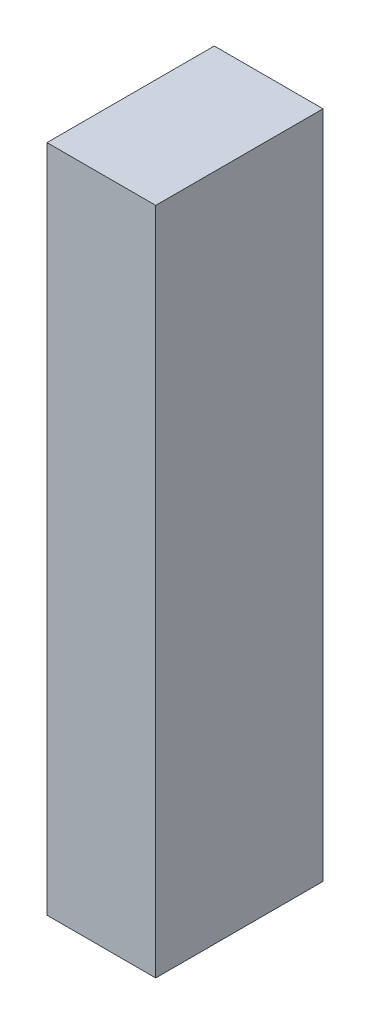
ISO-10303-21;
HEADER;
FILE_DESCRIPTION(('STEP AP214'),'2;1');
FILE_NAME('part.step','',(''),(''),'','','');
FILE_SCHEMA(('AUTOMOTIVE_DESIGN { 1 0 10303 214 1 1 1 1 }'));
ENDSEC;
DATA;
#1=APPLICATION_CONTEXT('core data for automotive mechanical design processes');
#2=APPLICATION_PROTOCOL_DEFINITION('international standard','automotive_design',2000,#1);
#3=PRODUCT_CONTEXT('',#1,'mechanical');
#4=PRODUCT('Part','Part','',(#3));
#5=PRODUCT_RELATED_PRODUCT_CATEGORY('part','',(#4));
#6=PRODUCT_DEFINITION_FORMATION('','',#4);
#7=PRODUCT_DEFINITION_CONTEXT('part definition',#1,'design');
#8=PRODUCT_DEFINITION('design','',#6,#7);
#9=PRODUCT_DEFINITION_SHAPE('','',#8);
#10=(LENGTH_UNIT() NAMED_UNIT(*) SI_UNIT(.MILLI.,.METRE.));
#11=(NAMED_UNIT(*) PLANE_ANGLE_UNIT() SI_UNIT($,.RADIAN.));
#12=(NAMED_UNIT(*) SI_UNIT($,.STERADIAN.) SOLID_ANGLE_UNIT());
#13=UNCERTAINTY_MEASURE_WITH_UNIT(LENGTH_MEASURE(1.E-05),#10,'distance_accuracy_value','');
#14=(GEOMETRIC_REPRESENTATION_CONTEXT(3) GLOBAL_UNCERTAINTY_ASSIGNED_CONTEXT((#13)) GLOBAL_UNIT_ASSIGNED_CONTEXT((#10,
#11,#12)) REPRESENTATION_CONTEXT('',''));
#15=CARTESIAN_POINT('',(0.,0.,0.));
#16=DIRECTION('',(0.,0.,1.));
#17=DIRECTION('',(1.,0.,0.));
#18=AXIS2_PLACEMENT_3D('',#15,#16,#17);
#19=CARTESIAN_POINT('',(32.5,400.,-50.));
#20=DIRECTION('',(-1.,0.,0.));
#21=DIRECTION('',(0.,0.,1.));
#22=AXIS2_PLACEMENT_3D('',#19,#20,#21);
#23=PLANE('',#22);
#24=DIRECTION('',(0.,0.,-1.));
#25=VECTOR('',#24,1.);
#26=CARTESIAN_POINT('',(32.5,0.,-50.));
#27=LINE('',#26,#25);
#28=CARTESIAN_POINT('',(32.5,0.,50.));
#29=VERTEX_POINT('',#28);
#30=CARTESIAN_POINT('',(32.5,0.,-50.));
#31=VERTEX_POINT('',#30);
#32=EDGE_CURVE('E113',#29,#31,#27,.T.);
#33=ORIENTED_EDGE('',*,*,#32,.T.);
#34=DIRECTION('',(0.,-1.,0.));
#35=VECTOR('',#34,1.);
#36=CARTESIAN_POINT('',(32.5,400.,-50.));
#37=LINE('',#36,#35);
#38=CARTESIAN_POINT('',(32.5,400.,-50.));
#39=VERTEX_POINT('',#38);
#40=EDGE_CURVE('E11',#39,#31,#37,.T.);
#41=ORIENTED_EDGE('',*,*,#40,.F.);
#42=DIRECTION('',(0.,0.,-1.));
#43=VECTOR('',#42,1.);
#44=CARTESIAN_POINT('',(32.5,400.,-50.));
#45=LINE('',#44,#43);
#46=CARTESIAN_POINT('',(32.5,400.,50.));
#47=VERTEX_POINT('',#46);
#48=EDGE_CURVE('E97',#47,#39,#45,.T.);
#49=ORIENTED_EDGE('',*,*,#48,.F.);
#50=DIRECTION('',(0.,-1.,0.));
#51=VECTOR('',#50,1.);
#52=CARTESIAN_POINT('',(32.5,400.,50.));
#53=LINE('',#52,#51);
#54=EDGE_CURVE('E109',#47,#29,#53,.T.);
#55=ORIENTED_EDGE('',*,*,#54,.T.);
#56=EDGE_LOOP('',(#33,#41,#49,#55));
#57=FACE_BOUND('',#56,.T.);
#58=ADVANCED_FACE('F45',(#57),#23,.F.);
#59=CARTESIAN_POINT('',(-32.5,400.,-50.));
#60=DIRECTION('',(0.,0.,1.));
#61=DIRECTION('',(1.,0.,0.));
#62=AXIS2_PLACEMENT_3D('',#59,#60,#61);
#63=PLANE('',#62);
#64=DIRECTION('',(-1.,0.,0.));
#65=VECTOR('',#64,1.);
#66=CARTESIAN_POINT('',(-32.5,0.,-50.));
#67=LINE('',#66,#65);
#68=CARTESIAN_POINT('',(-32.5,0.,-50.));
#69=VERTEX_POINT('',#68);
#70=EDGE_CURVE('E102',#31,#69,#67,.T.);
#71=ORIENTED_EDGE('',*,*,#70,.T.);
#72=DIRECTION('',(0.,-1.,0.));
#73=VECTOR('',#72,1.);
#74=CARTESIAN_POINT('',(-32.5,400.,-50.));
#75=LINE('',#74,#73);
#76=CARTESIAN_POINT('',(-32.5,400.,-50.));
#77=VERTEX_POINT('',#76);
#78=EDGE_CURVE('E54',#77,#69,#75,.T.);
#79=ORIENTED_EDGE('',*,*,#78,.F.);
#80=DIRECTION('',(-1.,0.,0.));
#81=VECTOR('',#80,1.);
#82=CARTESIAN_POINT('',(-32.5,400.,-50.));
#83=LINE('',#82,#81);
#84=EDGE_CURVE('E92',#39,#77,#83,.T.);
#85=ORIENTED_EDGE('',*,*,#84,.F.);
#86=ORIENTED_EDGE('',*,*,#40,.T.);
#87=EDGE_LOOP('',(#71,#79,#85,#86));
#88=FACE_BOUND('',#87,.T.);
#89=ADVANCED_FACE('F101',(#88),#63,.F.);
#90=CARTESIAN_POINT('',(-32.5,400.,-50.));
#91=DIRECTION('',(1.,0.,0.));
#92=DIRECTION('',(0.,0.,-1.));
#93=AXIS2_PLACEMENT_3D('',#90,#91,#92);
#94=PLANE('',#93);
#95=DIRECTION('',(0.,0.,1.));
#96=VECTOR('',#95,1.);
#97=CARTESIAN_POINT('',(-32.5,0.,-50.));
#98=LINE('',#97,#96);
#99=CARTESIAN_POINT('',(-32.5,0.,50.));
#100=VERTEX_POINT('',#99);
#101=EDGE_CURVE('E79',#69,#100,#98,.T.);
#102=ORIENTED_EDGE('',*,*,#101,.T.);
#103=DIRECTION('',(0.,-1.,0.));
#104=VECTOR('',#103,1.);
#105=CARTESIAN_POINT('',(-32.5,400.,50.));
#106=LINE('',#105,#104);
#107=CARTESIAN_POINT('',(-32.5,400.,50.));
#108=VERTEX_POINT('',#107);
#109=EDGE_CURVE('E104',#108,#100,#106,.T.);
#110=ORIENTED_EDGE('',*,*,#109,.F.);
#111=DIRECTION('',(0.,0.,1.));
#112=VECTOR('',#111,1.);
#113=CARTESIAN_POINT('',(-32.5,400.,-50.));
#114=LINE('',#113,#112);
#115=EDGE_CURVE('E95',#77,#108,#114,.T.);
#116=ORIENTED_EDGE('',*,*,#115,.F.);
#117=ORIENTED_EDGE('',*,*,#78,.T.);
#118=EDGE_LOOP('',(#102,#110,#116,#117));
#119=FACE_BOUND('',#118,.T.);
#120=ADVANCED_FACE('F105',(#119),#94,.F.);
#121=CARTESIAN_POINT('',(-32.5,400.,50.));
#122=DIRECTION('',(0.,0.,-1.));
#123=DIRECTION('',(-1.,0.,0.));
#124=AXIS2_PLACEMENT_3D('',#121,#122,#123);
#125=PLANE('',#124);
#126=DIRECTION('',(1.,0.,0.));
#127=VECTOR('',#126,1.);
#128=CARTESIAN_POINT('',(-32.5,0.,50.));
#129=LINE('',#128,#127);
#130=EDGE_CURVE('E85',#100,#29,#129,.T.);
#131=ORIENTED_EDGE('',*,*,#130,.T.);
#132=ORIENTED_EDGE('',*,*,#54,.F.);
#133=DIRECTION('',(1.,0.,0.));
#134=VECTOR('',#133,1.);
#135=CARTESIAN_POINT('',(-32.5,400.,50.));
#136=LINE('',#135,#134);
#137=EDGE_CURVE('E62',#108,#47,#136,.T.);
#138=ORIENTED_EDGE('',*,*,#137,.F.);
#139=ORIENTED_EDGE('',*,*,#109,.T.);
#140=EDGE_LOOP('',(#131,#132,#138,#139));
#141=FACE_BOUND('',#140,.T.);
#142=ADVANCED_FACE('F126',(#141),#125,.F.);
#143=CARTESIAN_POINT('',(0.,400.,0.));
#144=DIRECTION('',(0.,1.,0.));
#145=DIRECTION('',(0.,0.,1.));
#146=AXIS2_PLACEMENT_3D('',#143,#144,#145);
#147=PLANE('',#146);
#148=ORIENTED_EDGE('',*,*,#48,.T.);
#149=ORIENTED_EDGE('',*,*,#84,.T.);
#150=ORIENTED_EDGE('',*,*,#115,.T.);
#151=ORIENTED_EDGE('',*,*,#137,.T.);
#152=EDGE_LOOP('',(#148,#149,#150,#151));
#153=FACE_BOUND('',#152,.T.);
#154=ADVANCED_FACE('F93',(#153),#147,.T.);
#155=CARTESIAN_POINT('',(0.,0.,0.));
#156=DIRECTION('',(0.,1.,0.));
#157=DIRECTION('',(0.,0.,1.));
#158=AXIS2_PLACEMENT_3D('',#155,#156,#157);
#159=PLANE('',#158);
#160=ORIENTED_EDGE('',*,*,#32,.F.);
#161=ORIENTED_EDGE('',*,*,#130,.F.);
#162=ORIENTED_EDGE('',*,*,#101,.F.);
#163=ORIENTED_EDGE('',*,*,#70,.F.);
#164=EDGE_LOOP('',(#160,#161,#162,#163));
#165=FACE_BOUND('',#164,.T.);
#166=ADVANCED_FACE('F129',(#165),#159,.F.);
#167=CLOSED_SHELL('',(#58,#89,#120,#142,#154,#166));
#168=MANIFOLD_SOLID_BREP('B2',#167);
#169=ADVANCED_BREP_SHAPE_REPRESENTATION('',(#18,#168),#14);
#170=SHAPE_DEFINITION_REPRESENTATION(#9,#169);
ENDSEC;
END-ISO-10303-21;
